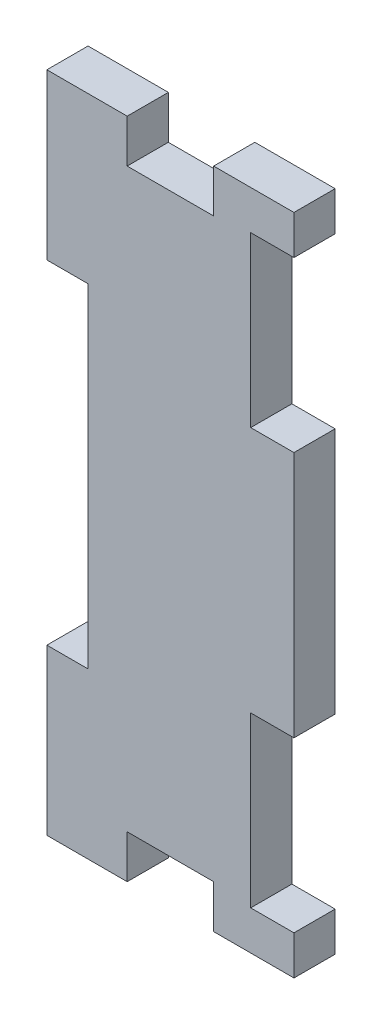
ISO-10303-21;
HEADER;
FILE_DESCRIPTION(('STEP AP214'),'2;1');
FILE_NAME('part.step','',(''),(''),'','','');
FILE_SCHEMA(('AUTOMOTIVE_DESIGN { 1 0 10303 214 1 1 1 1 }'));
ENDSEC;
DATA;
#1=APPLICATION_CONTEXT('core data for automotive mechanical design processes');
#2=APPLICATION_PROTOCOL_DEFINITION('international standard','automotive_design',2000,#1);
#3=PRODUCT_CONTEXT('',#1,'mechanical');
#4=PRODUCT('Part','Part','',(#3));
#5=PRODUCT_RELATED_PRODUCT_CATEGORY('part','',(#4));
#6=PRODUCT_DEFINITION_FORMATION('','',#4);
#7=PRODUCT_DEFINITION_CONTEXT('part definition',#1,'design');
#8=PRODUCT_DEFINITION('design','',#6,#7);
#9=PRODUCT_DEFINITION_SHAPE('','',#8);
#10=(LENGTH_UNIT() NAMED_UNIT(*) SI_UNIT(.MILLI.,.METRE.));
#11=(NAMED_UNIT(*) PLANE_ANGLE_UNIT() SI_UNIT($,.RADIAN.));
#12=(NAMED_UNIT(*) SI_UNIT($,.STERADIAN.) SOLID_ANGLE_UNIT());
#13=UNCERTAINTY_MEASURE_WITH_UNIT(LENGTH_MEASURE(1.E-05),#10,'distance_accuracy_value','');
#14=(GEOMETRIC_REPRESENTATION_CONTEXT(3) GLOBAL_UNCERTAINTY_ASSIGNED_CONTEXT((#13)) GLOBAL_UNIT_ASSIGNED_CONTEXT((#10,
#11,#12)) REPRESENTATION_CONTEXT('',''));
#15=CARTESIAN_POINT('',(0.,0.,0.));
#16=DIRECTION('',(0.,0.,1.));
#17=DIRECTION('',(1.,0.,0.));
#18=AXIS2_PLACEMENT_3D('',#15,#16,#17);
#19=CARTESIAN_POINT('',(113.746163941899,-128.757377287974,2.5));
#20=DIRECTION('',(-1.,0.,0.));
#21=DIRECTION('',(0.,0.,1.));
#22=AXIS2_PLACEMENT_3D('',#19,#20,#21);
#23=PLANE('',#22);
#24=DIRECTION('',(0.,1.,0.));
#25=VECTOR('',#24,1.);
#26=CARTESIAN_POINT('',(113.746163941899,-128.757377287974,-2.5));
#27=LINE('',#26,#25);
#28=CARTESIAN_POINT('',(113.746163941899,-128.757377287974,-2.5));
#29=VERTEX_POINT('',#28);
#30=CARTESIAN_POINT('',(113.746163941899,-98.7574082032687,-2.5));
#31=VERTEX_POINT('',#30);
#32=EDGE_CURVE('E225',#29,#31,#27,.T.);
#33=ORIENTED_EDGE('',*,*,#32,.T.);
#34=DIRECTION('',(0.,0.,-1.));
#35=VECTOR('',#34,1.);
#36=CARTESIAN_POINT('',(113.746163941899,-98.7574082032687,2.5));
#37=LINE('',#36,#35);
#38=CARTESIAN_POINT('',(113.746163941899,-98.7574082032687,2.5));
#39=VERTEX_POINT('',#38);
#40=EDGE_CURVE('E11',#39,#31,#37,.T.);
#41=ORIENTED_EDGE('',*,*,#40,.F.);
#42=DIRECTION('',(0.,1.,0.));
#43=VECTOR('',#42,1.);
#44=CARTESIAN_POINT('',(113.746163941899,-128.757377287974,2.5));
#45=LINE('',#44,#43);
#46=CARTESIAN_POINT('',(113.746163941899,-128.757377287974,2.5));
#47=VERTEX_POINT('',#46);
#48=EDGE_CURVE('E271',#47,#39,#45,.T.);
#49=ORIENTED_EDGE('',*,*,#48,.F.);
#50=DIRECTION('',(0.,0.,-1.));
#51=VECTOR('',#50,1.);
#52=CARTESIAN_POINT('',(113.746163941899,-128.757377287974,2.5));
#53=LINE('',#52,#51);
#54=EDGE_CURVE('E221',#47,#29,#53,.T.);
#55=ORIENTED_EDGE('',*,*,#54,.T.);
#56=EDGE_LOOP('',(#33,#41,#49,#55));
#57=FACE_BOUND('',#56,.T.);
#58=ADVANCED_FACE('F33',(#57),#23,.F.);
#59=CARTESIAN_POINT('',(113.746163941899,-98.7574082032687,2.5));
#60=DIRECTION('',(0.,-1.,0.));
#61=DIRECTION('',(0.,0.,-1.));
#62=AXIS2_PLACEMENT_3D('',#59,#60,#61);
#63=PLANE('',#62);
#64=DIRECTION('',(-1.,0.,0.));
#65=VECTOR('',#64,1.);
#66=CARTESIAN_POINT('',(113.746163941899,-98.7574082032687,-2.5));
#67=LINE('',#66,#65);
#68=CARTESIAN_POINT('',(108.496163941899,-98.7574082032687,-2.5));
#69=VERTEX_POINT('',#68);
#70=EDGE_CURVE('E228',#31,#69,#67,.T.);
#71=ORIENTED_EDGE('',*,*,#70,.T.);
#72=DIRECTION('',(0.,0.,-1.));
#73=VECTOR('',#72,1.);
#74=CARTESIAN_POINT('',(108.496163941899,-98.7574082032687,2.5));
#75=LINE('',#74,#73);
#76=CARTESIAN_POINT('',(108.496163941899,-98.7574082032687,2.5));
#77=VERTEX_POINT('',#76);
#78=EDGE_CURVE('E41',#77,#69,#75,.T.);
#79=ORIENTED_EDGE('',*,*,#78,.F.);
#80=DIRECTION('',(-1.,0.,0.));
#81=VECTOR('',#80,1.);
#82=CARTESIAN_POINT('',(113.746163941899,-98.7574082032687,2.5));
#83=LINE('',#82,#81);
#84=EDGE_CURVE('E140',#39,#77,#83,.T.);
#85=ORIENTED_EDGE('',*,*,#84,.F.);
#86=ORIENTED_EDGE('',*,*,#40,.T.);
#87=EDGE_LOOP('',(#71,#79,#85,#86));
#88=FACE_BOUND('',#87,.T.);
#89=ADVANCED_FACE('F409',(#88),#63,.F.);
#90=CARTESIAN_POINT('',(108.496163941899,-98.7574082032687,2.5));
#91=DIRECTION('',(-1.,0.,0.));
#92=DIRECTION('',(0.,0.,1.));
#93=AXIS2_PLACEMENT_3D('',#90,#91,#92);
#94=PLANE('',#93);
#95=DIRECTION('',(0.,1.,0.));
#96=VECTOR('',#95,1.);
#97=CARTESIAN_POINT('',(108.496163941899,-98.7574082032687,-2.5));
#98=LINE('',#97,#96);
#99=CARTESIAN_POINT('',(108.496163941899,-78.2574082032687,-2.5));
#100=VERTEX_POINT('',#99);
#101=EDGE_CURVE('E230',#69,#100,#98,.T.);
#102=ORIENTED_EDGE('',*,*,#101,.T.);
#103=DIRECTION('',(0.,0.,-1.));
#104=VECTOR('',#103,1.);
#105=CARTESIAN_POINT('',(108.496163941899,-78.2574082032687,2.5));
#106=LINE('',#105,#104);
#107=CARTESIAN_POINT('',(108.496163941899,-78.2574082032687,2.5));
#108=VERTEX_POINT('',#107);
#109=EDGE_CURVE('E326',#108,#100,#106,.T.);
#110=ORIENTED_EDGE('',*,*,#109,.F.);
#111=DIRECTION('',(0.,1.,0.));
#112=VECTOR('',#111,1.);
#113=CARTESIAN_POINT('',(108.496163941899,-98.7574082032687,2.5));
#114=LINE('',#113,#112);
#115=EDGE_CURVE('E334',#77,#108,#114,.T.);
#116=ORIENTED_EDGE('',*,*,#115,.F.);
#117=ORIENTED_EDGE('',*,*,#78,.T.);
#118=EDGE_LOOP('',(#102,#110,#116,#117));
#119=FACE_BOUND('',#118,.T.);
#120=ADVANCED_FACE('F332',(#119),#94,.F.);
#121=CARTESIAN_POINT('',(108.496163941899,-78.2574082032687,2.5));
#122=DIRECTION('',(0.,1.,0.));
#123=DIRECTION('',(0.,0.,1.));
#124=AXIS2_PLACEMENT_3D('',#121,#122,#123);
#125=PLANE('',#124);
#126=DIRECTION('',(1.,0.,0.));
#127=VECTOR('',#126,1.);
#128=CARTESIAN_POINT('',(108.496163941899,-78.2574082032687,-2.5));
#129=LINE('',#128,#127);
#130=CARTESIAN_POINT('',(113.746163941899,-78.2574082032687,-2.5));
#131=VERTEX_POINT('',#130);
#132=EDGE_CURVE('E232',#100,#131,#129,.T.);
#133=ORIENTED_EDGE('',*,*,#132,.T.);
#134=DIRECTION('',(0.,0.,-1.));
#135=VECTOR('',#134,1.);
#136=CARTESIAN_POINT('',(113.746163941899,-78.2574082032687,2.5));
#137=LINE('',#136,#135);
#138=CARTESIAN_POINT('',(113.746163941899,-78.2574082032687,2.5));
#139=VERTEX_POINT('',#138);
#140=EDGE_CURVE('E323',#139,#131,#137,.T.);
#141=ORIENTED_EDGE('',*,*,#140,.F.);
#142=DIRECTION('',(1.,0.,0.));
#143=VECTOR('',#142,1.);
#144=CARTESIAN_POINT('',(108.496163941899,-78.2574082032687,2.5));
#145=LINE('',#144,#143);
#146=EDGE_CURVE('E352',#108,#139,#145,.T.);
#147=ORIENTED_EDGE('',*,*,#146,.F.);
#148=ORIENTED_EDGE('',*,*,#109,.T.);
#149=EDGE_LOOP('',(#133,#141,#147,#148));
#150=FACE_BOUND('',#149,.T.);
#151=ADVANCED_FACE('F343',(#150),#125,.F.);
#152=CARTESIAN_POINT('',(113.746163941899,-78.2574082032687,2.5));
#153=DIRECTION('',(-1.,0.,0.));
#154=DIRECTION('',(0.,0.,1.));
#155=AXIS2_PLACEMENT_3D('',#152,#153,#154);
#156=PLANE('',#155);
#157=DIRECTION('',(0.,1.,0.));
#158=VECTOR('',#157,1.);
#159=CARTESIAN_POINT('',(113.746163941899,-78.2574082032687,-2.5));
#160=LINE('',#159,#158);
#161=CARTESIAN_POINT('',(113.746163941899,-73.507408203269,-2.5));
#162=VERTEX_POINT('',#161);
#163=EDGE_CURVE('E234',#131,#162,#160,.T.);
#164=ORIENTED_EDGE('',*,*,#163,.T.);
#165=DIRECTION('',(0.,0.,-1.));
#166=VECTOR('',#165,1.);
#167=CARTESIAN_POINT('',(113.746163941899,-73.507408203269,2.5));
#168=LINE('',#167,#166);
#169=CARTESIAN_POINT('',(113.746163941899,-73.507408203269,2.5));
#170=VERTEX_POINT('',#169);
#171=EDGE_CURVE('E320',#170,#162,#168,.T.);
#172=ORIENTED_EDGE('',*,*,#171,.F.);
#173=DIRECTION('',(0.,1.,0.));
#174=VECTOR('',#173,1.);
#175=CARTESIAN_POINT('',(113.746163941899,-78.2574082032687,2.5));
#176=LINE('',#175,#174);
#177=EDGE_CURVE('E349',#139,#170,#176,.T.);
#178=ORIENTED_EDGE('',*,*,#177,.F.);
#179=ORIENTED_EDGE('',*,*,#140,.T.);
#180=EDGE_LOOP('',(#164,#172,#178,#179));
#181=FACE_BOUND('',#180,.T.);
#182=ADVANCED_FACE('F347',(#181),#156,.F.);
#183=CARTESIAN_POINT('',(103.9961639419,-73.507408203269,2.5));
#184=DIRECTION('',(0.,-1.,0.));
#185=DIRECTION('',(0.,0.,-1.));
#186=AXIS2_PLACEMENT_3D('',#183,#184,#185);
#187=PLANE('',#186);
#188=DIRECTION('',(-1.,0.,0.));
#189=VECTOR('',#188,1.);
#190=CARTESIAN_POINT('',(103.9961639419,-73.507408203269,-2.5));
#191=LINE('',#190,#189);
#192=CARTESIAN_POINT('',(103.9961639419,-73.507408203269,-2.5));
#193=VERTEX_POINT('',#192);
#194=EDGE_CURVE('E236',#162,#193,#191,.T.);
#195=ORIENTED_EDGE('',*,*,#194,.T.);
#196=DIRECTION('',(0.,0.,-1.));
#197=VECTOR('',#196,1.);
#198=CARTESIAN_POINT('',(103.9961639419,-73.507408203269,2.5));
#199=LINE('',#198,#197);
#200=CARTESIAN_POINT('',(103.9961639419,-73.507408203269,2.5));
#201=VERTEX_POINT('',#200);
#202=EDGE_CURVE('E317',#201,#193,#199,.T.);
#203=ORIENTED_EDGE('',*,*,#202,.F.);
#204=DIRECTION('',(-1.,0.,0.));
#205=VECTOR('',#204,1.);
#206=CARTESIAN_POINT('',(103.9961639419,-73.507408203269,2.5));
#207=LINE('',#206,#205);
#208=EDGE_CURVE('E351',#170,#201,#207,.T.);
#209=ORIENTED_EDGE('',*,*,#208,.F.);
#210=ORIENTED_EDGE('',*,*,#171,.T.);
#211=EDGE_LOOP('',(#195,#203,#209,#210));
#212=FACE_BOUND('',#211,.T.);
#213=ADVANCED_FACE('F422',(#212),#187,.F.);
#214=CARTESIAN_POINT('',(103.9961639419,-78.7574082032696,2.5));
#215=DIRECTION('',(1.,0.,0.));
#216=DIRECTION('',(0.,0.,-1.));
#217=AXIS2_PLACEMENT_3D('',#214,#215,#216);
#218=PLANE('',#217);
#219=DIRECTION('',(0.,-1.,0.));
#220=VECTOR('',#219,1.);
#221=CARTESIAN_POINT('',(103.9961639419,-78.7574082032696,-2.5));
#222=LINE('',#221,#220);
#223=CARTESIAN_POINT('',(103.9961639419,-78.7574082032696,-2.5));
#224=VERTEX_POINT('',#223);
#225=EDGE_CURVE('E238',#193,#224,#222,.T.);
#226=ORIENTED_EDGE('',*,*,#225,.T.);
#227=DIRECTION('',(0.,0.,-1.));
#228=VECTOR('',#227,1.);
#229=CARTESIAN_POINT('',(103.9961639419,-78.7574082032696,2.5));
#230=LINE('',#229,#228);
#231=CARTESIAN_POINT('',(103.9961639419,-78.7574082032696,2.5));
#232=VERTEX_POINT('',#231);
#233=EDGE_CURVE('E314',#232,#224,#230,.T.);
#234=ORIENTED_EDGE('',*,*,#233,.F.);
#235=DIRECTION('',(0.,-1.,0.));
#236=VECTOR('',#235,1.);
#237=CARTESIAN_POINT('',(103.9961639419,-78.7574082032696,2.5));
#238=LINE('',#237,#236);
#239=EDGE_CURVE('E354',#201,#232,#238,.T.);
#240=ORIENTED_EDGE('',*,*,#239,.F.);
#241=ORIENTED_EDGE('',*,*,#202,.T.);
#242=EDGE_LOOP('',(#226,#234,#240,#241));
#243=FACE_BOUND('',#242,.T.);
#244=ADVANCED_FACE('F425',(#243),#218,.F.);
#245=CARTESIAN_POINT('',(93.4961639418998,-78.7574082032696,2.5));
#246=DIRECTION('',(0.,-1.,0.));
#247=DIRECTION('',(0.,0.,-1.));
#248=AXIS2_PLACEMENT_3D('',#245,#246,#247);
#249=PLANE('',#248);
#250=DIRECTION('',(-1.,0.,0.));
#251=VECTOR('',#250,1.);
#252=CARTESIAN_POINT('',(93.4961639418998,-78.7574082032696,-2.5));
#253=LINE('',#252,#251);
#254=CARTESIAN_POINT('',(93.4961639418998,-78.7574082032696,-2.5));
#255=VERTEX_POINT('',#254);
#256=EDGE_CURVE('E240',#224,#255,#253,.T.);
#257=ORIENTED_EDGE('',*,*,#256,.T.);
#258=DIRECTION('',(0.,0.,-1.));
#259=VECTOR('',#258,1.);
#260=CARTESIAN_POINT('',(93.4961639418998,-78.7574082032696,2.5));
#261=LINE('',#260,#259);
#262=CARTESIAN_POINT('',(93.4961639418998,-78.7574082032696,2.5));
#263=VERTEX_POINT('',#262);
#264=EDGE_CURVE('E311',#263,#255,#261,.T.);
#265=ORIENTED_EDGE('',*,*,#264,.F.);
#266=DIRECTION('',(-1.,0.,0.));
#267=VECTOR('',#266,1.);
#268=CARTESIAN_POINT('',(93.4961639418998,-78.7574082032696,2.5));
#269=LINE('',#268,#267);
#270=EDGE_CURVE('E360',#232,#263,#269,.T.);
#271=ORIENTED_EDGE('',*,*,#270,.F.);
#272=ORIENTED_EDGE('',*,*,#233,.T.);
#273=EDGE_LOOP('',(#257,#265,#271,#272));
#274=FACE_BOUND('',#273,.T.);
#275=ADVANCED_FACE('F429',(#274),#249,.F.);
#276=CARTESIAN_POINT('',(93.4961639418998,-73.507408203269,2.5));
#277=DIRECTION('',(-1.,0.,0.));
#278=DIRECTION('',(0.,0.,1.));
#279=AXIS2_PLACEMENT_3D('',#276,#277,#278);
#280=PLANE('',#279);
#281=DIRECTION('',(0.,1.,0.));
#282=VECTOR('',#281,1.);
#283=CARTESIAN_POINT('',(93.4961639418998,-73.507408203269,-2.5));
#284=LINE('',#283,#282);
#285=CARTESIAN_POINT('',(93.4961639418998,-73.507408203269,-2.5));
#286=VERTEX_POINT('',#285);
#287=EDGE_CURVE('E242',#255,#286,#284,.T.);
#288=ORIENTED_EDGE('',*,*,#287,.T.);
#289=DIRECTION('',(0.,0.,-1.));
#290=VECTOR('',#289,1.);
#291=CARTESIAN_POINT('',(93.4961639418998,-73.507408203269,2.5));
#292=LINE('',#291,#290);
#293=CARTESIAN_POINT('',(93.4961639418998,-73.507408203269,2.5));
#294=VERTEX_POINT('',#293);
#295=EDGE_CURVE('E308',#294,#286,#292,.T.);
#296=ORIENTED_EDGE('',*,*,#295,.F.);
#297=DIRECTION('',(0.,1.,0.));
#298=VECTOR('',#297,1.);
#299=CARTESIAN_POINT('',(93.4961639418998,-73.507408203269,2.5));
#300=LINE('',#299,#298);
#301=EDGE_CURVE('E362',#263,#294,#300,.T.);
#302=ORIENTED_EDGE('',*,*,#301,.F.);
#303=ORIENTED_EDGE('',*,*,#264,.T.);
#304=EDGE_LOOP('',(#288,#296,#302,#303));
#305=FACE_BOUND('',#304,.T.);
#306=ADVANCED_FACE('F433',(#305),#280,.F.);
#307=CARTESIAN_POINT('',(83.7461639419005,-73.507408203269,2.5));
#308=DIRECTION('',(0.,-1.,0.));
#309=DIRECTION('',(0.,0.,-1.));
#310=AXIS2_PLACEMENT_3D('',#307,#308,#309);
#311=PLANE('',#310);
#312=DIRECTION('',(-1.,0.,0.));
#313=VECTOR('',#312,1.);
#314=CARTESIAN_POINT('',(83.7461639419005,-73.507408203269,-2.5));
#315=LINE('',#314,#313);
#316=CARTESIAN_POINT('',(83.7461639419005,-73.507408203269,-2.5));
#317=VERTEX_POINT('',#316);
#318=EDGE_CURVE('E244',#286,#317,#315,.T.);
#319=ORIENTED_EDGE('',*,*,#318,.T.);
#320=DIRECTION('',(0.,0.,-1.));
#321=VECTOR('',#320,1.);
#322=CARTESIAN_POINT('',(83.7461639419005,-73.507408203269,2.5));
#323=LINE('',#322,#321);
#324=CARTESIAN_POINT('',(83.7461639419005,-73.507408203269,2.5));
#325=VERTEX_POINT('',#324);
#326=EDGE_CURVE('E305',#325,#317,#323,.T.);
#327=ORIENTED_EDGE('',*,*,#326,.F.);
#328=DIRECTION('',(-1.,0.,0.));
#329=VECTOR('',#328,1.);
#330=CARTESIAN_POINT('',(83.7461639419005,-73.507408203269,2.5));
#331=LINE('',#330,#329);
#332=EDGE_CURVE('E364',#294,#325,#331,.T.);
#333=ORIENTED_EDGE('',*,*,#332,.F.);
#334=ORIENTED_EDGE('',*,*,#295,.T.);
#335=EDGE_LOOP('',(#319,#327,#333,#334));
#336=FACE_BOUND('',#335,.T.);
#337=ADVANCED_FACE('F437',(#336),#311,.F.);
#338=CARTESIAN_POINT('',(83.7461639419005,-93.5074082032692,2.5));
#339=DIRECTION('',(1.,0.,0.));
#340=DIRECTION('',(0.,0.,-1.));
#341=AXIS2_PLACEMENT_3D('',#338,#339,#340);
#342=PLANE('',#341);
#343=DIRECTION('',(0.,-1.,0.));
#344=VECTOR('',#343,1.);
#345=CARTESIAN_POINT('',(83.7461639419005,-93.5074082032692,-2.5));
#346=LINE('',#345,#344);
#347=CARTESIAN_POINT('',(83.7461639419005,-93.5074082032692,-2.5));
#348=VERTEX_POINT('',#347);
#349=EDGE_CURVE('E246',#317,#348,#346,.T.);
#350=ORIENTED_EDGE('',*,*,#349,.T.);
#351=DIRECTION('',(0.,0.,-1.));
#352=VECTOR('',#351,1.);
#353=CARTESIAN_POINT('',(83.7461639419005,-93.5074082032692,2.5));
#354=LINE('',#353,#352);
#355=CARTESIAN_POINT('',(83.7461639419005,-93.5074082032692,2.5));
#356=VERTEX_POINT('',#355);
#357=EDGE_CURVE('E302',#356,#348,#354,.T.);
#358=ORIENTED_EDGE('',*,*,#357,.F.);
#359=DIRECTION('',(0.,-1.,0.));
#360=VECTOR('',#359,1.);
#361=CARTESIAN_POINT('',(83.7461639419005,-93.5074082032692,2.5));
#362=LINE('',#361,#360);
#363=EDGE_CURVE('E366',#325,#356,#362,.T.);
#364=ORIENTED_EDGE('',*,*,#363,.F.);
#365=ORIENTED_EDGE('',*,*,#326,.T.);
#366=EDGE_LOOP('',(#350,#358,#364,#365));
#367=FACE_BOUND('',#366,.T.);
#368=ADVANCED_FACE('F441',(#367),#342,.F.);
#369=CARTESIAN_POINT('',(88.7461639418994,-93.5074082032692,2.5));
#370=DIRECTION('',(0.,1.,0.));
#371=DIRECTION('',(0.,0.,1.));
#372=AXIS2_PLACEMENT_3D('',#369,#370,#371);
#373=PLANE('',#372);
#374=DIRECTION('',(1.,0.,0.));
#375=VECTOR('',#374,1.);
#376=CARTESIAN_POINT('',(88.7461639418994,-93.5074082032692,-2.5));
#377=LINE('',#376,#375);
#378=CARTESIAN_POINT('',(88.7461639418994,-93.5074082032692,-2.5));
#379=VERTEX_POINT('',#378);
#380=EDGE_CURVE('E248',#348,#379,#377,.T.);
#381=ORIENTED_EDGE('',*,*,#380,.T.);
#382=DIRECTION('',(0.,0.,-1.));
#383=VECTOR('',#382,1.);
#384=CARTESIAN_POINT('',(88.7461639418994,-93.5074082032692,2.5));
#385=LINE('',#384,#383);
#386=CARTESIAN_POINT('',(88.7461639418994,-93.5074082032692,2.5));
#387=VERTEX_POINT('',#386);
#388=EDGE_CURVE('E299',#387,#379,#385,.T.);
#389=ORIENTED_EDGE('',*,*,#388,.F.);
#390=DIRECTION('',(1.,0.,0.));
#391=VECTOR('',#390,1.);
#392=CARTESIAN_POINT('',(88.7461639418994,-93.5074082032692,2.5));
#393=LINE('',#392,#391);
#394=EDGE_CURVE('E368',#356,#387,#393,.T.);
#395=ORIENTED_EDGE('',*,*,#394,.F.);
#396=ORIENTED_EDGE('',*,*,#357,.T.);
#397=EDGE_LOOP('',(#381,#389,#395,#396));
#398=FACE_BOUND('',#397,.T.);
#399=ADVANCED_FACE('F445',(#398),#373,.F.);
#400=CARTESIAN_POINT('',(88.7461639418994,-134.007377287974,2.5));
#401=DIRECTION('',(1.,0.,0.));
#402=DIRECTION('',(0.,0.,-1.));
#403=AXIS2_PLACEMENT_3D('',#400,#401,#402);
#404=PLANE('',#403);
#405=DIRECTION('',(0.,-1.,0.));
#406=VECTOR('',#405,1.);
#407=CARTESIAN_POINT('',(88.7461639418994,-134.007377287974,-2.5));
#408=LINE('',#407,#406);
#409=CARTESIAN_POINT('',(88.7461639418994,-134.007377287974,-2.5));
#410=VERTEX_POINT('',#409);
#411=EDGE_CURVE('E250',#379,#410,#408,.T.);
#412=ORIENTED_EDGE('',*,*,#411,.T.);
#413=DIRECTION('',(0.,0.,-1.));
#414=VECTOR('',#413,1.);
#415=CARTESIAN_POINT('',(88.7461639418994,-134.007377287974,2.5));
#416=LINE('',#415,#414);
#417=CARTESIAN_POINT('',(88.7461639418994,-134.007377287974,2.5));
#418=VERTEX_POINT('',#417);
#419=EDGE_CURVE('E296',#418,#410,#416,.T.);
#420=ORIENTED_EDGE('',*,*,#419,.F.);
#421=DIRECTION('',(0.,-1.,0.));
#422=VECTOR('',#421,1.);
#423=CARTESIAN_POINT('',(88.7461639418994,-134.007377287974,2.5));
#424=LINE('',#423,#422);
#425=EDGE_CURVE('E370',#387,#418,#424,.T.);
#426=ORIENTED_EDGE('',*,*,#425,.F.);
#427=ORIENTED_EDGE('',*,*,#388,.T.);
#428=EDGE_LOOP('',(#412,#420,#426,#427));
#429=FACE_BOUND('',#428,.T.);
#430=ADVANCED_FACE('F449',(#429),#404,.F.);
#431=CARTESIAN_POINT('',(88.7461639418994,-134.007377287974,2.5));
#432=DIRECTION('',(0.,-1.,0.));
#433=DIRECTION('',(0.,0.,-1.));
#434=AXIS2_PLACEMENT_3D('',#431,#432,#433);
#435=PLANE('',#434);
#436=DIRECTION('',(-1.,0.,0.));
#437=VECTOR('',#436,1.);
#438=CARTESIAN_POINT('',(88.7461639418994,-134.007377287974,-2.5));
#439=LINE('',#438,#437);
#440=CARTESIAN_POINT('',(83.7461639419005,-134.007377287974,-2.5));
#441=VERTEX_POINT('',#440);
#442=EDGE_CURVE('E252',#410,#441,#439,.T.);
#443=ORIENTED_EDGE('',*,*,#442,.T.);
#444=DIRECTION('',(0.,0.,-1.));
#445=VECTOR('',#444,1.);
#446=CARTESIAN_POINT('',(83.7461639419005,-134.007377287974,2.5));
#447=LINE('',#446,#445);
#448=CARTESIAN_POINT('',(83.7461639419005,-134.007377287974,2.5));
#449=VERTEX_POINT('',#448);
#450=EDGE_CURVE('E293',#449,#441,#447,.T.);
#451=ORIENTED_EDGE('',*,*,#450,.F.);
#452=DIRECTION('',(-1.,0.,0.));
#453=VECTOR('',#452,1.);
#454=CARTESIAN_POINT('',(88.7461639418994,-134.007377287974,2.5));
#455=LINE('',#454,#453);
#456=EDGE_CURVE('E372',#418,#449,#455,.T.);
#457=ORIENTED_EDGE('',*,*,#456,.F.);
#458=ORIENTED_EDGE('',*,*,#419,.T.);
#459=EDGE_LOOP('',(#443,#451,#457,#458));
#460=FACE_BOUND('',#459,.T.);
#461=ADVANCED_FACE('F453',(#460),#435,.F.);
#462=CARTESIAN_POINT('',(83.7461639419005,-134.007377287974,2.5));
#463=DIRECTION('',(1.,0.,0.));
#464=DIRECTION('',(0.,0.,-1.));
#465=AXIS2_PLACEMENT_3D('',#462,#463,#464);
#466=PLANE('',#465);
#467=DIRECTION('',(0.,-1.,0.));
#468=VECTOR('',#467,1.);
#469=CARTESIAN_POINT('',(83.7461639419005,-134.007377287974,-2.5));
#470=LINE('',#469,#468);
#471=CARTESIAN_POINT('',(83.7461639419005,-154.007377287974,-2.5));
#472=VERTEX_POINT('',#471);
#473=EDGE_CURVE('E254',#441,#472,#470,.T.);
#474=ORIENTED_EDGE('',*,*,#473,.T.);
#475=DIRECTION('',(0.,0.,-1.));
#476=VECTOR('',#475,1.);
#477=CARTESIAN_POINT('',(83.7461639419005,-154.007377287974,2.5));
#478=LINE('',#477,#476);
#479=CARTESIAN_POINT('',(83.7461639419005,-154.007377287974,2.5));
#480=VERTEX_POINT('',#479);
#481=EDGE_CURVE('E290',#480,#472,#478,.T.);
#482=ORIENTED_EDGE('',*,*,#481,.F.);
#483=DIRECTION('',(0.,-1.,0.));
#484=VECTOR('',#483,1.);
#485=CARTESIAN_POINT('',(83.7461639419005,-134.007377287974,2.5));
#486=LINE('',#485,#484);
#487=EDGE_CURVE('E374',#449,#480,#486,.T.);
#488=ORIENTED_EDGE('',*,*,#487,.F.);
#489=ORIENTED_EDGE('',*,*,#450,.T.);
#490=EDGE_LOOP('',(#474,#482,#488,#489));
#491=FACE_BOUND('',#490,.T.);
#492=ADVANCED_FACE('F457',(#491),#466,.F.);
#493=CARTESIAN_POINT('',(83.7461639419005,-154.007377287974,2.5));
#494=DIRECTION('',(0.,1.,0.));
#495=DIRECTION('',(0.,0.,1.));
#496=AXIS2_PLACEMENT_3D('',#493,#494,#495);
#497=PLANE('',#496);
#498=DIRECTION('',(1.,0.,0.));
#499=VECTOR('',#498,1.);
#500=CARTESIAN_POINT('',(83.7461639419005,-154.007377287974,-2.5));
#501=LINE('',#500,#499);
#502=CARTESIAN_POINT('',(93.4961639418998,-154.007377287974,-2.5));
#503=VERTEX_POINT('',#502);
#504=EDGE_CURVE('E256',#472,#503,#501,.T.);
#505=ORIENTED_EDGE('',*,*,#504,.T.);
#506=DIRECTION('',(0.,0.,-1.));
#507=VECTOR('',#506,1.);
#508=CARTESIAN_POINT('',(93.4961639418998,-154.007377287974,2.5));
#509=LINE('',#508,#507);
#510=CARTESIAN_POINT('',(93.4961639418998,-154.007377287974,2.5));
#511=VERTEX_POINT('',#510);
#512=EDGE_CURVE('E287',#511,#503,#509,.T.);
#513=ORIENTED_EDGE('',*,*,#512,.F.);
#514=DIRECTION('',(1.,0.,0.));
#515=VECTOR('',#514,1.);
#516=CARTESIAN_POINT('',(83.7461639419005,-154.007377287974,2.5));
#517=LINE('',#516,#515);
#518=EDGE_CURVE('E376',#480,#511,#517,.T.);
#519=ORIENTED_EDGE('',*,*,#518,.F.);
#520=ORIENTED_EDGE('',*,*,#481,.T.);
#521=EDGE_LOOP('',(#505,#513,#519,#520));
#522=FACE_BOUND('',#521,.T.);
#523=ADVANCED_FACE('F461',(#522),#497,.F.);
#524=CARTESIAN_POINT('',(93.4961639418998,-154.007377287974,2.5));
#525=DIRECTION('',(-1.,0.,0.));
#526=DIRECTION('',(0.,0.,1.));
#527=AXIS2_PLACEMENT_3D('',#524,#525,#526);
#528=PLANE('',#527);
#529=DIRECTION('',(0.,1.,0.));
#530=VECTOR('',#529,1.);
#531=CARTESIAN_POINT('',(93.4961639418998,-154.007377287974,-2.5));
#532=LINE('',#531,#530);
#533=CARTESIAN_POINT('',(93.4961639418998,-148.757377287973,-2.5));
#534=VERTEX_POINT('',#533);
#535=EDGE_CURVE('E258',#503,#534,#532,.T.);
#536=ORIENTED_EDGE('',*,*,#535,.T.);
#537=DIRECTION('',(0.,0.,-1.));
#538=VECTOR('',#537,1.);
#539=CARTESIAN_POINT('',(93.4961639418998,-148.757377287973,2.5));
#540=LINE('',#539,#538);
#541=CARTESIAN_POINT('',(93.4961639418998,-148.757377287973,2.5));
#542=VERTEX_POINT('',#541);
#543=EDGE_CURVE('E284',#542,#534,#540,.T.);
#544=ORIENTED_EDGE('',*,*,#543,.F.);
#545=DIRECTION('',(0.,1.,0.));
#546=VECTOR('',#545,1.);
#547=CARTESIAN_POINT('',(93.4961639418998,-154.007377287974,2.5));
#548=LINE('',#547,#546);
#549=EDGE_CURVE('E378',#511,#542,#548,.T.);
#550=ORIENTED_EDGE('',*,*,#549,.F.);
#551=ORIENTED_EDGE('',*,*,#512,.T.);
#552=EDGE_LOOP('',(#536,#544,#550,#551));
#553=FACE_BOUND('',#552,.T.);
#554=ADVANCED_FACE('F465',(#553),#528,.F.);
#555=CARTESIAN_POINT('',(93.4961639418998,-148.757377287973,2.5));
#556=DIRECTION('',(0.,1.,0.));
#557=DIRECTION('',(0.,0.,1.));
#558=AXIS2_PLACEMENT_3D('',#555,#556,#557);
#559=PLANE('',#558);
#560=DIRECTION('',(1.,0.,0.));
#561=VECTOR('',#560,1.);
#562=CARTESIAN_POINT('',(93.4961639418998,-148.757377287973,-2.5));
#563=LINE('',#562,#561);
#564=CARTESIAN_POINT('',(103.9961639419,-148.757377287973,-2.5));
#565=VERTEX_POINT('',#564);
#566=EDGE_CURVE('E260',#534,#565,#563,.T.);
#567=ORIENTED_EDGE('',*,*,#566,.T.);
#568=DIRECTION('',(0.,0.,-1.));
#569=VECTOR('',#568,1.);
#570=CARTESIAN_POINT('',(103.9961639419,-148.757377287973,2.5));
#571=LINE('',#570,#569);
#572=CARTESIAN_POINT('',(103.9961639419,-148.757377287973,2.5));
#573=VERTEX_POINT('',#572);
#574=EDGE_CURVE('E281',#573,#565,#571,.T.);
#575=ORIENTED_EDGE('',*,*,#574,.F.);
#576=DIRECTION('',(1.,0.,0.));
#577=VECTOR('',#576,1.);
#578=CARTESIAN_POINT('',(93.4961639418998,-148.757377287973,2.5));
#579=LINE('',#578,#577);
#580=EDGE_CURVE('E380',#542,#573,#579,.T.);
#581=ORIENTED_EDGE('',*,*,#580,.F.);
#582=ORIENTED_EDGE('',*,*,#543,.T.);
#583=EDGE_LOOP('',(#567,#575,#581,#582));
#584=FACE_BOUND('',#583,.T.);
#585=ADVANCED_FACE('F469',(#584),#559,.F.);
#586=CARTESIAN_POINT('',(103.9961639419,-148.757377287973,2.5));
#587=DIRECTION('',(1.,0.,0.));
#588=DIRECTION('',(0.,0.,-1.));
#589=AXIS2_PLACEMENT_3D('',#586,#587,#588);
#590=PLANE('',#589);
#591=DIRECTION('',(0.,-1.,0.));
#592=VECTOR('',#591,1.);
#593=CARTESIAN_POINT('',(103.9961639419,-148.757377287973,-2.5));
#594=LINE('',#593,#592);
#595=CARTESIAN_POINT('',(103.9961639419,-154.007377287974,-2.5));
#596=VERTEX_POINT('',#595);
#597=EDGE_CURVE('E262',#565,#596,#594,.T.);
#598=ORIENTED_EDGE('',*,*,#597,.T.);
#599=DIRECTION('',(0.,0.,-1.));
#600=VECTOR('',#599,1.);
#601=CARTESIAN_POINT('',(103.9961639419,-154.007377287974,2.5));
#602=LINE('',#601,#600);
#603=CARTESIAN_POINT('',(103.9961639419,-154.007377287974,2.5));
#604=VERTEX_POINT('',#603);
#605=EDGE_CURVE('E278',#604,#596,#602,.T.);
#606=ORIENTED_EDGE('',*,*,#605,.F.);
#607=DIRECTION('',(0.,-1.,0.));
#608=VECTOR('',#607,1.);
#609=CARTESIAN_POINT('',(103.9961639419,-148.757377287973,2.5));
#610=LINE('',#609,#608);
#611=EDGE_CURVE('E382',#573,#604,#610,.T.);
#612=ORIENTED_EDGE('',*,*,#611,.F.);
#613=ORIENTED_EDGE('',*,*,#574,.T.);
#614=EDGE_LOOP('',(#598,#606,#612,#613));
#615=FACE_BOUND('',#614,.T.);
#616=ADVANCED_FACE('F473',(#615),#590,.F.);
#617=CARTESIAN_POINT('',(103.9961639419,-154.007377287974,2.5));
#618=DIRECTION('',(0.,1.,0.));
#619=DIRECTION('',(0.,0.,1.));
#620=AXIS2_PLACEMENT_3D('',#617,#618,#619);
#621=PLANE('',#620);
#622=DIRECTION('',(1.,0.,0.));
#623=VECTOR('',#622,1.);
#624=CARTESIAN_POINT('',(103.9961639419,-154.007377287974,-2.5));
#625=LINE('',#624,#623);
#626=CARTESIAN_POINT('',(113.746163941899,-154.007377287974,-2.5));
#627=VERTEX_POINT('',#626);
#628=EDGE_CURVE('E264',#596,#627,#625,.T.);
#629=ORIENTED_EDGE('',*,*,#628,.T.);
#630=DIRECTION('',(0.,0.,-1.));
#631=VECTOR('',#630,1.);
#632=CARTESIAN_POINT('',(113.746163941899,-154.007377287974,2.5));
#633=LINE('',#632,#631);
#634=CARTESIAN_POINT('',(113.746163941899,-154.007377287974,2.5));
#635=VERTEX_POINT('',#634);
#636=EDGE_CURVE('E275',#635,#627,#633,.T.);
#637=ORIENTED_EDGE('',*,*,#636,.F.);
#638=DIRECTION('',(1.,0.,0.));
#639=VECTOR('',#638,1.);
#640=CARTESIAN_POINT('',(103.9961639419,-154.007377287974,2.5));
#641=LINE('',#640,#639);
#642=EDGE_CURVE('E384',#604,#635,#641,.T.);
#643=ORIENTED_EDGE('',*,*,#642,.F.);
#644=ORIENTED_EDGE('',*,*,#605,.T.);
#645=EDGE_LOOP('',(#629,#637,#643,#644));
#646=FACE_BOUND('',#645,.T.);
#647=ADVANCED_FACE('F390',(#646),#621,.F.);
#648=CARTESIAN_POINT('',(113.746163941899,-149.257377287974,2.5));
#649=DIRECTION('',(-1.,0.,0.));
#650=DIRECTION('',(0.,0.,1.));
#651=AXIS2_PLACEMENT_3D('',#648,#649,#650);
#652=PLANE('',#651);
#653=DIRECTION('',(0.,1.,0.));
#654=VECTOR('',#653,1.);
#655=CARTESIAN_POINT('',(113.746163941899,-149.257377287974,-2.5));
#656=LINE('',#655,#654);
#657=CARTESIAN_POINT('',(113.746163941899,-149.257377287974,-2.5));
#658=VERTEX_POINT('',#657);
#659=EDGE_CURVE('E266',#627,#658,#656,.T.);
#660=ORIENTED_EDGE('',*,*,#659,.T.);
#661=DIRECTION('',(0.,0.,-1.));
#662=VECTOR('',#661,1.);
#663=CARTESIAN_POINT('',(113.746163941899,-149.257377287974,2.5));
#664=LINE('',#663,#662);
#665=CARTESIAN_POINT('',(113.746163941899,-149.257377287974,2.5));
#666=VERTEX_POINT('',#665);
#667=EDGE_CURVE('E216',#666,#658,#664,.T.);
#668=ORIENTED_EDGE('',*,*,#667,.F.);
#669=DIRECTION('',(0.,1.,0.));
#670=VECTOR('',#669,1.);
#671=CARTESIAN_POINT('',(113.746163941899,-149.257377287974,2.5));
#672=LINE('',#671,#670);
#673=EDGE_CURVE('E207',#635,#666,#672,.T.);
#674=ORIENTED_EDGE('',*,*,#673,.F.);
#675=ORIENTED_EDGE('',*,*,#636,.T.);
#676=EDGE_LOOP('',(#660,#668,#674,#675));
#677=FACE_BOUND('',#676,.T.);
#678=ADVANCED_FACE('F394',(#677),#652,.F.);
#679=CARTESIAN_POINT('',(108.496163941899,-149.257377287974,2.5));
#680=DIRECTION('',(0.,-1.,0.));
#681=DIRECTION('',(0.,0.,-1.));
#682=AXIS2_PLACEMENT_3D('',#679,#680,#681);
#683=PLANE('',#682);
#684=DIRECTION('',(-1.,0.,0.));
#685=VECTOR('',#684,1.);
#686=CARTESIAN_POINT('',(108.496163941899,-149.257377287974,-2.5));
#687=LINE('',#686,#685);
#688=CARTESIAN_POINT('',(108.496163941899,-149.257377287974,-2.5));
#689=VERTEX_POINT('',#688);
#690=EDGE_CURVE('E215',#658,#689,#687,.T.);
#691=ORIENTED_EDGE('',*,*,#690,.T.);
#692=DIRECTION('',(0.,0.,-1.));
#693=VECTOR('',#692,1.);
#694=CARTESIAN_POINT('',(108.496163941899,-149.257377287974,2.5));
#695=LINE('',#694,#693);
#696=CARTESIAN_POINT('',(108.496163941899,-149.257377287974,2.5));
#697=VERTEX_POINT('',#696);
#698=EDGE_CURVE('E212',#697,#689,#695,.T.);
#699=ORIENTED_EDGE('',*,*,#698,.F.);
#700=DIRECTION('',(-1.,0.,0.));
#701=VECTOR('',#700,1.);
#702=CARTESIAN_POINT('',(108.496163941899,-149.257377287974,2.5));
#703=LINE('',#702,#701);
#704=EDGE_CURVE('E201',#666,#697,#703,.T.);
#705=ORIENTED_EDGE('',*,*,#704,.F.);
#706=ORIENTED_EDGE('',*,*,#667,.T.);
#707=EDGE_LOOP('',(#691,#699,#705,#706));
#708=FACE_BOUND('',#707,.T.);
#709=ADVANCED_FACE('F213',(#708),#683,.F.);
#710=CARTESIAN_POINT('',(108.496163941899,-128.757377287974,2.5));
#711=DIRECTION('',(-1.,0.,0.));
#712=DIRECTION('',(0.,0.,1.));
#713=AXIS2_PLACEMENT_3D('',#710,#711,#712);
#714=PLANE('',#713);
#715=DIRECTION('',(0.,1.,0.));
#716=VECTOR('',#715,1.);
#717=CARTESIAN_POINT('',(108.496163941899,-128.757377287974,-2.5));
#718=LINE('',#717,#716);
#719=CARTESIAN_POINT('',(108.496163941899,-128.757377287974,-2.5));
#720=VERTEX_POINT('',#719);
#721=EDGE_CURVE('E126',#689,#720,#718,.T.);
#722=ORIENTED_EDGE('',*,*,#721,.T.);
#723=DIRECTION('',(0.,0.,-1.));
#724=VECTOR('',#723,1.);
#725=CARTESIAN_POINT('',(108.496163941899,-128.757377287974,2.5));
#726=LINE('',#725,#724);
#727=CARTESIAN_POINT('',(108.496163941899,-128.757377287974,2.5));
#728=VERTEX_POINT('',#727);
#729=EDGE_CURVE('E217',#728,#720,#726,.T.);
#730=ORIENTED_EDGE('',*,*,#729,.F.);
#731=DIRECTION('',(0.,1.,0.));
#732=VECTOR('',#731,1.);
#733=CARTESIAN_POINT('',(108.496163941899,-128.757377287974,2.5));
#734=LINE('',#733,#732);
#735=EDGE_CURVE('E205',#697,#728,#734,.T.);
#736=ORIENTED_EDGE('',*,*,#735,.F.);
#737=ORIENTED_EDGE('',*,*,#698,.T.);
#738=EDGE_LOOP('',(#722,#730,#736,#737));
#739=FACE_BOUND('',#738,.T.);
#740=ADVANCED_FACE('F219',(#739),#714,.F.);
#741=CARTESIAN_POINT('',(113.746163941899,-128.757377287974,2.5));
#742=DIRECTION('',(0.,1.,0.));
#743=DIRECTION('',(0.,0.,1.));
#744=AXIS2_PLACEMENT_3D('',#741,#742,#743);
#745=PLANE('',#744);
#746=DIRECTION('',(1.,0.,0.));
#747=VECTOR('',#746,1.);
#748=CARTESIAN_POINT('',(113.746163941899,-128.757377287974,-2.5));
#749=LINE('',#748,#747);
#750=EDGE_CURVE('E132',#720,#29,#749,.T.);
#751=ORIENTED_EDGE('',*,*,#750,.T.);
#752=ORIENTED_EDGE('',*,*,#54,.F.);
#753=DIRECTION('',(1.,0.,0.));
#754=VECTOR('',#753,1.);
#755=CARTESIAN_POINT('',(113.746163941899,-128.757377287974,2.5));
#756=LINE('',#755,#754);
#757=EDGE_CURVE('E49',#728,#47,#756,.T.);
#758=ORIENTED_EDGE('',*,*,#757,.F.);
#759=ORIENTED_EDGE('',*,*,#729,.T.);
#760=EDGE_LOOP('',(#751,#752,#758,#759));
#761=FACE_BOUND('',#760,.T.);
#762=ADVANCED_FACE('F398',(#761),#745,.F.);
#763=CARTESIAN_POINT('',(0.,0.,2.5));
#764=DIRECTION('',(0.,0.,1.));
#765=DIRECTION('',(1.,0.,0.));
#766=AXIS2_PLACEMENT_3D('',#763,#764,#765);
#767=PLANE('',#766);
#768=ORIENTED_EDGE('',*,*,#48,.T.);
#769=ORIENTED_EDGE('',*,*,#84,.T.);
#770=ORIENTED_EDGE('',*,*,#115,.T.);
#771=ORIENTED_EDGE('',*,*,#146,.T.);
#772=ORIENTED_EDGE('',*,*,#177,.T.);
#773=ORIENTED_EDGE('',*,*,#208,.T.);
#774=ORIENTED_EDGE('',*,*,#239,.T.);
#775=ORIENTED_EDGE('',*,*,#270,.T.);
#776=ORIENTED_EDGE('',*,*,#301,.T.);
#777=ORIENTED_EDGE('',*,*,#332,.T.);
#778=ORIENTED_EDGE('',*,*,#363,.T.);
#779=ORIENTED_EDGE('',*,*,#394,.T.);
#780=ORIENTED_EDGE('',*,*,#425,.T.);
#781=ORIENTED_EDGE('',*,*,#456,.T.);
#782=ORIENTED_EDGE('',*,*,#487,.T.);
#783=ORIENTED_EDGE('',*,*,#518,.T.);
#784=ORIENTED_EDGE('',*,*,#549,.T.);
#785=ORIENTED_EDGE('',*,*,#580,.T.);
#786=ORIENTED_EDGE('',*,*,#611,.T.);
#787=ORIENTED_EDGE('',*,*,#642,.T.);
#788=ORIENTED_EDGE('',*,*,#673,.T.);
#789=ORIENTED_EDGE('',*,*,#704,.T.);
#790=ORIENTED_EDGE('',*,*,#735,.T.);
#791=ORIENTED_EDGE('',*,*,#757,.T.);
#792=EDGE_LOOP('',(#768,#769,#770,#771,#772,#773,#774,#775,#776,#777,#778,#779,#780,#781,#782,
#783,#784,#785,#786,#787,#788,#789,#790,#791));
#793=FACE_BOUND('',#792,.T.);
#794=ADVANCED_FACE('F203',(#793),#767,.T.);
#795=CARTESIAN_POINT('',(0.,0.,-2.5));
#796=DIRECTION('',(0.,0.,1.));
#797=DIRECTION('',(1.,0.,0.));
#798=AXIS2_PLACEMENT_3D('',#795,#796,#797);
#799=PLANE('',#798);
#800=ORIENTED_EDGE('',*,*,#32,.F.);
#801=ORIENTED_EDGE('',*,*,#750,.F.);
#802=ORIENTED_EDGE('',*,*,#721,.F.);
#803=ORIENTED_EDGE('',*,*,#690,.F.);
#804=ORIENTED_EDGE('',*,*,#659,.F.);
#805=ORIENTED_EDGE('',*,*,#628,.F.);
#806=ORIENTED_EDGE('',*,*,#597,.F.);
#807=ORIENTED_EDGE('',*,*,#566,.F.);
#808=ORIENTED_EDGE('',*,*,#535,.F.);
#809=ORIENTED_EDGE('',*,*,#504,.F.);
#810=ORIENTED_EDGE('',*,*,#473,.F.);
#811=ORIENTED_EDGE('',*,*,#442,.F.);
#812=ORIENTED_EDGE('',*,*,#411,.F.);
#813=ORIENTED_EDGE('',*,*,#380,.F.);
#814=ORIENTED_EDGE('',*,*,#349,.F.);
#815=ORIENTED_EDGE('',*,*,#318,.F.);
#816=ORIENTED_EDGE('',*,*,#287,.F.);
#817=ORIENTED_EDGE('',*,*,#256,.F.);
#818=ORIENTED_EDGE('',*,*,#225,.F.);
#819=ORIENTED_EDGE('',*,*,#194,.F.);
#820=ORIENTED_EDGE('',*,*,#163,.F.);
#821=ORIENTED_EDGE('',*,*,#132,.F.);
#822=ORIENTED_EDGE('',*,*,#101,.F.);
#823=ORIENTED_EDGE('',*,*,#70,.F.);
#824=EDGE_LOOP('',(#800,#801,#802,#803,#804,#805,#806,#807,#808,#809,#810,#811,#812,#813,#814,
#815,#816,#817,#818,#819,#820,#821,#822,#823));
#825=FACE_BOUND('',#824,.T.);
#826=ADVANCED_FACE('F338',(#825),#799,.F.);
#827=CLOSED_SHELL('',(#58,#89,#120,#151,#182,#213,#244,#275,#306,#337,#368,#399,#430,#461,#492,
#523,#554,#585,#616,#647,#678,#709,#740,#762,#794,#826));
#828=MANIFOLD_SOLID_BREP('B2',#827);
#829=ADVANCED_BREP_SHAPE_REPRESENTATION('',(#18,#828),#14);
#830=SHAPE_DEFINITION_REPRESENTATION(#9,#829);
ENDSEC;
END-ISO-10303-21;
